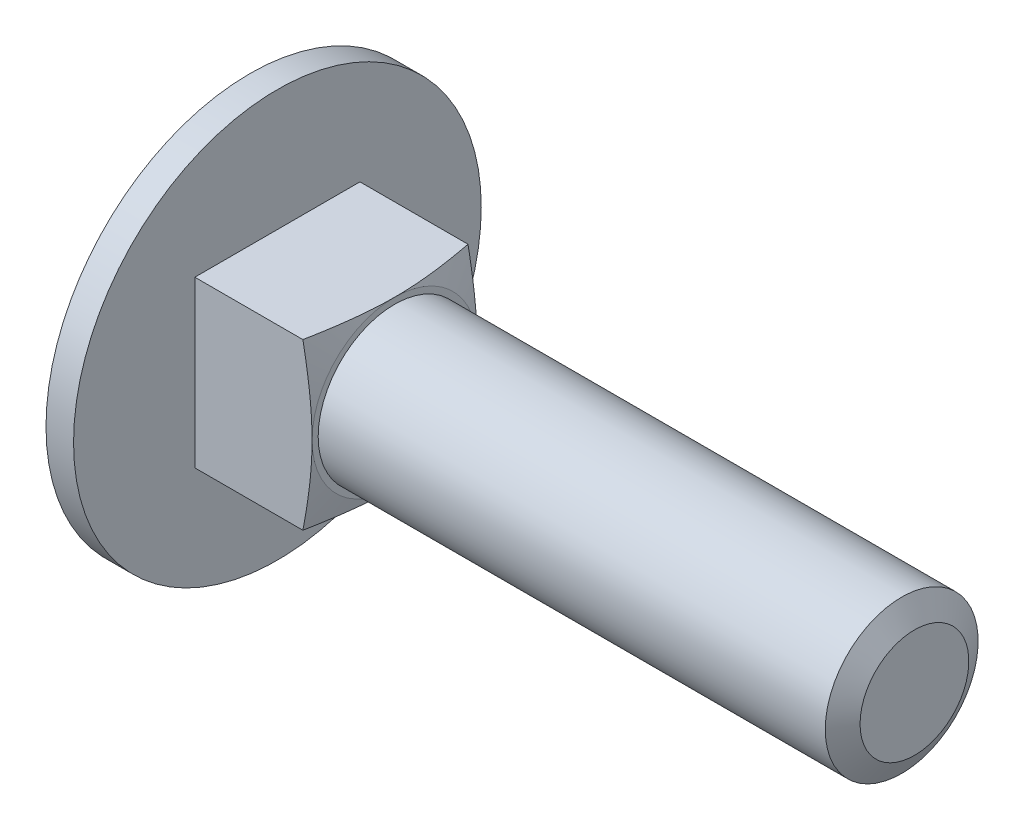
ISO-10303-21;
HEADER;
FILE_DESCRIPTION(('STEP AP214'),'2;1');
FILE_NAME('part.step','',(''),(''),'','','');
FILE_SCHEMA(('AUTOMOTIVE_DESIGN { 1 0 10303 214 1 1 1 1 }'));
ENDSEC;
DATA;
#1=APPLICATION_CONTEXT('core data for automotive mechanical design processes');
#2=APPLICATION_PROTOCOL_DEFINITION('international standard','automotive_design',2000,#1);
#3=PRODUCT_CONTEXT('',#1,'mechanical');
#4=PRODUCT('Part','Part','',(#3));
#5=PRODUCT_RELATED_PRODUCT_CATEGORY('part','',(#4));
#6=PRODUCT_DEFINITION_FORMATION('','',#4);
#7=PRODUCT_DEFINITION_CONTEXT('part definition',#1,'design');
#8=PRODUCT_DEFINITION('design','',#6,#7);
#9=PRODUCT_DEFINITION_SHAPE('','',#8);
#10=(LENGTH_UNIT() NAMED_UNIT(*) SI_UNIT(.MILLI.,.METRE.));
#11=(NAMED_UNIT(*) PLANE_ANGLE_UNIT() SI_UNIT($,.RADIAN.));
#12=(NAMED_UNIT(*) SI_UNIT($,.STERADIAN.) SOLID_ANGLE_UNIT());
#13=UNCERTAINTY_MEASURE_WITH_UNIT(LENGTH_MEASURE(1.E-05),#10,'distance_accuracy_value','');
#14=(GEOMETRIC_REPRESENTATION_CONTEXT(3) GLOBAL_UNCERTAINTY_ASSIGNED_CONTEXT((#13)) GLOBAL_UNIT_ASSIGNED_CONTEXT((#10,
#11,#12)) REPRESENTATION_CONTEXT('',''));
#15=CARTESIAN_POINT('',(0.,0.,0.));
#16=DIRECTION('',(0.,0.,1.));
#17=DIRECTION('',(1.,0.,0.));
#18=AXIS2_PLACEMENT_3D('',#15,#16,#17);
#19=CARTESIAN_POINT('',(0.,0.,0.));
#20=DIRECTION('',(-1.,0.,0.));
#21=DIRECTION('',(0.,0.,1.));
#22=AXIS2_PLACEMENT_3D('',#19,#20,#21);
#23=CYLINDRICAL_SURFACE('',#22,3.);
#24=CARTESIAN_POINT('',(4.6,0.,0.));
#25=DIRECTION('',(-1.,0.,0.));
#26=DIRECTION('',(0.,0.,1.));
#27=AXIS2_PLACEMENT_3D('',#24,#25,#26);
#28=CIRCLE('',#27,3.);
#29=CARTESIAN_POINT('',(4.6,0.,3.));
#30=VERTEX_POINT('',#29);
#31=EDGE_CURVE('E184',#30,#30,#28,.T.);
#32=ORIENTED_EDGE('',*,*,#31,.F.);
#33=EDGE_LOOP('',(#32));
#34=FACE_BOUND('',#33,.T.);
#35=CARTESIAN_POINT('',(24.5000146668818,0.,0.));
#36=DIRECTION('',(-1.,0.,0.));
#37=DIRECTION('',(0.,0.,1.));
#38=AXIS2_PLACEMENT_3D('',#35,#36,#37);
#39=CIRCLE('',#38,3.);
#40=CARTESIAN_POINT('',(24.5000146668818,0.,3.));
#41=VERTEX_POINT('',#40);
#42=EDGE_CURVE('E182',#41,#41,#39,.T.);
#43=ORIENTED_EDGE('',*,*,#42,.T.);
#44=EDGE_LOOP('',(#43));
#45=FACE_BOUND('',#44,.T.);
#46=ADVANCED_FACE('F42',(#34,#45),#23,.T.);
#47=CARTESIAN_POINT('',(4.6,-3.24,3.24));
#48=DIRECTION('',(1.,0.,0.));
#49=DIRECTION('',(0.,0.,-1.));
#50=AXIS2_PLACEMENT_3D('',#47,#48,#49);
#51=PLANE('',#50);
#52=CARTESIAN_POINT('',(4.6,0.,0.));
#53=DIRECTION('',(1.,0.,0.));
#54=DIRECTION('',(0.,0.,-1.));
#55=AXIS2_PLACEMENT_3D('',#52,#53,#54);
#56=CIRCLE('',#55,3.24);
#57=CARTESIAN_POINT('',(4.6,-3.24,0.));
#58=VERTEX_POINT('',#57);
#59=CARTESIAN_POINT('',(4.6,0.,-3.24));
#60=VERTEX_POINT('',#59);
#61=EDGE_CURVE('E46',#58,#60,#56,.T.);
#62=ORIENTED_EDGE('',*,*,#61,.T.);
#63=CARTESIAN_POINT('',(4.6,0.,0.));
#64=DIRECTION('',(1.,0.,0.));
#65=DIRECTION('',(0.,0.,-1.));
#66=AXIS2_PLACEMENT_3D('',#63,#64,#65);
#67=CIRCLE('',#66,3.24);
#68=CARTESIAN_POINT('',(4.6,3.24,0.));
#69=VERTEX_POINT('',#68);
#70=EDGE_CURVE('E58',#60,#69,#67,.T.);
#71=ORIENTED_EDGE('',*,*,#70,.T.);
#72=CARTESIAN_POINT('',(4.6,0.,3.24));
#73=VERTEX_POINT('',#72);
#74=EDGE_CURVE('E12',#69,#73,#56,.T.);
#75=ORIENTED_EDGE('',*,*,#74,.T.);
#76=EDGE_CURVE('E51',#73,#58,#56,.T.);
#77=ORIENTED_EDGE('',*,*,#76,.T.);
#78=EDGE_LOOP('',(#62,#71,#75,#77));
#79=FACE_BOUND('',#78,.T.);
#80=ORIENTED_EDGE('',*,*,#31,.T.);
#81=EDGE_LOOP('',(#80));
#82=FACE_BOUND('',#81,.T.);
#83=ADVANCED_FACE('F112',(#79,#82),#51,.T.);
#84=CARTESIAN_POINT('',(4.6,3.24,3.24));
#85=DIRECTION('',(0.,0.,-1.));
#86=DIRECTION('',(0.,1.,0.));
#87=AXIS2_PLACEMENT_3D('',#84,#85,#86);
#88=PLANE('',#87);
#89=CARTESIAN_POINT('',(3.51272290842033,-6.5391051248718,3.24));
#90=CARTESIAN_POINT('',(3.55325644828455,-6.37025363442656,3.24));
#91=CARTESIAN_POINT('',(3.59350949337711,-6.20133410505043,3.24));
#92=CARTESIAN_POINT('',(3.67330216122302,-5.86332389811059,3.24));
#93=CARTESIAN_POINT('',(3.71284177258357,-5.69423321785923,3.24));
#94=CARTESIAN_POINT('',(3.79104233265989,-5.35590079791098,3.24));
#95=CARTESIAN_POINT('',(3.82970353644131,-5.18665911728691,3.24));
#96=CARTESIAN_POINT('',(3.90594939327065,-4.84793340291623,3.24));
#97=CARTESIAN_POINT('',(3.943534049223,-4.67844936982475,3.24));
#98=CARTESIAN_POINT('',(4.01712401218816,-4.34025350431348,3.24));
#99=CARTESIAN_POINT('',(4.05313776131698,-4.17154351411169,3.24));
#100=CARTESIAN_POINT('',(4.12348484087673,-3.83377392118535,3.24));
#101=CARTESIAN_POINT('',(4.15781818775057,-3.66471432189863,3.24));
#102=CARTESIAN_POINT('',(4.22436824035208,-3.32606146344654,3.24));
#103=CARTESIAN_POINT('',(4.2565835414773,-3.15646792676365,3.24));
#104=CARTESIAN_POINT('',(4.31827425155827,-2.81677828005964,3.24));
#105=CARTESIAN_POINT('',(4.34774963962999,-2.646682166218,3.24));
#106=CARTESIAN_POINT('',(4.40354760779084,-2.30375234705419,3.24));
#107=CARTESIAN_POINT('',(4.42982545306293,-2.13091128484597,3.24));
#108=CARTESIAN_POINT('',(4.47781558001512,-1.78458776106533,3.24));
#109=CARTESIAN_POINT('',(4.49952787428122,-1.61110530126242,3.24));
#110=CARTESIAN_POINT('',(4.53726610364649,-1.26375854241936,3.24));
#111=CARTESIAN_POINT('',(4.5533000130518,-1.08989512662747,3.24));
#112=CARTESIAN_POINT('',(4.57867481209055,-0.741675535073899,3.24));
#113=CARTESIAN_POINT('',(4.58801596269693,-0.567319378791992,3.24));
#114=CARTESIAN_POINT('',(4.59929574331581,-0.217500527994458,3.24));
#115=CARTESIAN_POINT('',(4.60119766246974,-0.0420366150878778,3.24));
#116=CARTESIAN_POINT('',(4.59733161579242,0.308804457924704,3.24));
#117=CARTESIAN_POINT('',(4.59156363239594,0.484181617831109,3.24));
#118=CARTESIAN_POINT('',(4.57283367766896,0.834781492290775,3.24));
#119=CARTESIAN_POINT('',(4.55986189962343,1.01000366946467,3.24));
#120=CARTESIAN_POINT('',(4.52766468310088,1.35985705837279,3.24));
#121=CARTESIAN_POINT('',(4.50843929522191,1.53448827487695,3.24));
#122=CARTESIAN_POINT('',(4.44767143379602,2.0207677939745,3.24));
#123=CARTESIAN_POINT('',(4.40049516096884,2.33170442501846,3.24));
#124=CARTESIAN_POINT('',(4.2955004478646,2.95180002578575,3.24));
#125=CARTESIAN_POINT('',(4.2376785311992,3.2609583806961,3.24));
#126=CARTESIAN_POINT('',(4.11520578663932,3.87820911588209,3.24));
#127=CARTESIAN_POINT('',(4.05054852388665,4.18630020457055,3.24));
#128=CARTESIAN_POINT('',(3.91683614868663,4.80147237637126,3.24));
#129=CARTESIAN_POINT('',(3.84778162932323,5.10855358984055,3.24));
#130=CARTESIAN_POINT('',(3.70651015490809,5.72293375724909,3.24));
#131=CARTESIAN_POINT('',(3.63428451057403,6.03023070361889,3.24));
#132=CARTESIAN_POINT('',(3.48777027709658,6.64434000528029,3.24));
#133=CARTESIAN_POINT('',(3.41348162825657,6.95115234627692,3.24));
#134=CARTESIAN_POINT('',(3.26347258400187,7.5642432811377,3.24));
#135=CARTESIAN_POINT('',(3.1877530168983,7.87052207808857,3.24));
#136=CARTESIAN_POINT('',(3.03522679902508,8.48280910646495,3.24));
#137=CARTESIAN_POINT('',(2.95842014604834,8.7888173373398,3.24));
#138=CARTESIAN_POINT('',(2.72903751795626,9.69761854040159,3.24));
#139=CARTESIAN_POINT('',(2.57529502336965,10.3001168536813,3.24));
#140=CARTESIAN_POINT('',(2.26588245010327,11.5047312609368,3.24));
#141=CARTESIAN_POINT('',(2.11021203259914,12.1068472676014,3.24));
#142=CARTESIAN_POINT('',(1.79849015402933,13.3074342373561,3.24));
#143=CARTESIAN_POINT('',(1.64244553664376,13.9059069786891,3.24));
#144=CARTESIAN_POINT('',(1.32951161995667,15.1025135679528,3.24));
#145=CARTESIAN_POINT('',(1.17262248200706,15.7006474580628,3.24));
#146=CARTESIAN_POINT('',(1.0154747520641,16.2987127812786,3.24));
#147=B_SPLINE_CURVE_WITH_KNOTS('',3,(#89,#90,#91,#92,#93,#94,#95,#96,#97,#98,#99,#100,#101,#102,
#103,#104,#105,#106,#107,#108,#109,#110,#111,#112,#113,#114,#115,#116,#117,#118,#119,#120,#121,
#122,#123,#124,#125,#126,#127,#128,#129,#130,#131,#132,#133,#134,#135,#136,#137,#138,#139,#140,
#141,#142,#143,#144,#145,#146),.UNSPECIFIED.,.F.,.F.,(4,2,2,2,2,2,2,2,2,2,2,2,2,2,2,2,2,2,2,2,2,
2,2,2,2,2,2,2,4),(0.,0.520946218666703,1.04190074895937,1.56270202333278,2.08350189249811,
2.60102827670827,3.11854959585979,3.63641072284977,4.15427579672703,4.67870980132321,
5.20314236017698,5.72683549654152,6.25050821125709,6.77676189154188,7.3030167770292,
7.82998982951111,8.35695861835193,9.30011065607157,10.2435712328613,11.1879280377774,
12.1321577404025,13.0791595739382,14.0261888392389,14.9726857453906,15.9191845734607,
17.7845922722619,19.6503325968942,21.5057767189906,23.3608781079732),.UNSPECIFIED.);
#148=CARTESIAN_POINT('',(4.24039826591668,3.24,3.24));
#149=VERTEX_POINT('',#148);
#150=EDGE_CURVE('E94',#149,#73,#147,.F.);
#151=ORIENTED_EDGE('',*,*,#150,.F.);
#152=DIRECTION('',(-1.,0.,0.));
#153=VECTOR('',#152,1.);
#154=CARTESIAN_POINT('',(4.6,3.24,3.24));
#155=LINE('',#154,#153);
#156=CARTESIAN_POINT('',(0.,3.24,3.24));
#157=VERTEX_POINT('',#156);
#158=EDGE_CURVE('E225',#149,#157,#155,.T.);
#159=ORIENTED_EDGE('',*,*,#158,.T.);
#160=DIRECTION('',(0.,-1.,0.));
#161=VECTOR('',#160,1.);
#162=CARTESIAN_POINT('',(0.,3.24,3.24));
#163=LINE('',#162,#161);
#164=CARTESIAN_POINT('',(0.,-3.24,3.24));
#165=VERTEX_POINT('',#164);
#166=EDGE_CURVE('E102',#157,#165,#163,.T.);
#167=ORIENTED_EDGE('',*,*,#166,.T.);
#168=DIRECTION('',(-1.,0.,0.));
#169=VECTOR('',#168,1.);
#170=CARTESIAN_POINT('',(4.6,-3.24,3.24));
#171=LINE('',#170,#169);
#172=CARTESIAN_POINT('',(4.24039826591668,-3.24,3.24));
#173=VERTEX_POINT('',#172);
#174=EDGE_CURVE('E117',#173,#165,#171,.T.);
#175=ORIENTED_EDGE('',*,*,#174,.F.);
#176=EDGE_CURVE('E103',#73,#173,#147,.F.);
#177=ORIENTED_EDGE('',*,*,#176,.F.);
#178=EDGE_LOOP('',(#151,#159,#167,#175,#177));
#179=FACE_BOUND('',#178,.T.);
#180=ADVANCED_FACE('F115',(#179),#88,.F.);
#181=CARTESIAN_POINT('',(4.6,-3.24,3.24));
#182=DIRECTION('',(0.,1.,0.));
#183=DIRECTION('',(0.,0.,1.));
#184=AXIS2_PLACEMENT_3D('',#181,#182,#183);
#185=PLANE('',#184);
#186=CARTESIAN_POINT('',(3.51272290842033,-3.24,-6.5391051248718));
#187=CARTESIAN_POINT('',(3.55325644828455,-3.24,-6.37025363442656));
#188=CARTESIAN_POINT('',(3.59350949337711,-3.24,-6.20133410505043));
#189=CARTESIAN_POINT('',(3.67330216122302,-3.24,-5.86332389811059));
#190=CARTESIAN_POINT('',(3.71284177258357,-3.24,-5.69423321785923));
#191=CARTESIAN_POINT('',(3.79104233265989,-3.24,-5.35590079791098));
#192=CARTESIAN_POINT('',(3.82970353644131,-3.24,-5.18665911728691));
#193=CARTESIAN_POINT('',(3.90594939327065,-3.24,-4.84793340291623));
#194=CARTESIAN_POINT('',(3.943534049223,-3.24,-4.67844936982475));
#195=CARTESIAN_POINT('',(4.01712401218816,-3.24,-4.34025350431348));
#196=CARTESIAN_POINT('',(4.05313776131698,-3.24,-4.17154351411169));
#197=CARTESIAN_POINT('',(4.12348484087673,-3.24,-3.83377392118535));
#198=CARTESIAN_POINT('',(4.15781818775057,-3.24,-3.66471432189863));
#199=CARTESIAN_POINT('',(4.22436824035208,-3.24,-3.32606146344654));
#200=CARTESIAN_POINT('',(4.2565835414773,-3.24,-3.15646792676365));
#201=CARTESIAN_POINT('',(4.31827425155827,-3.24,-2.81677828005964));
#202=CARTESIAN_POINT('',(4.34774963962999,-3.24,-2.646682166218));
#203=CARTESIAN_POINT('',(4.40354760779084,-3.24,-2.30375234705419));
#204=CARTESIAN_POINT('',(4.42982545306293,-3.24,-2.13091128484597));
#205=CARTESIAN_POINT('',(4.47781558001512,-3.24,-1.78458776106533));
#206=CARTESIAN_POINT('',(4.49952787428122,-3.24,-1.61110530126242));
#207=CARTESIAN_POINT('',(4.53726610364649,-3.24,-1.26375854241936));
#208=CARTESIAN_POINT('',(4.5533000130518,-3.24,-1.08989512662747));
#209=CARTESIAN_POINT('',(4.57867481209055,-3.24,-0.741675535073899));
#210=CARTESIAN_POINT('',(4.58801596269693,-3.24,-0.567319378791992));
#211=CARTESIAN_POINT('',(4.59929574331581,-3.24,-0.217500527994458));
#212=CARTESIAN_POINT('',(4.60119766246974,-3.24,-0.0420366150878778));
#213=CARTESIAN_POINT('',(4.59733161579242,-3.24,0.308804457924704));
#214=CARTESIAN_POINT('',(4.59156363239594,-3.24,0.484181617831109));
#215=CARTESIAN_POINT('',(4.57283367766896,-3.24,0.834781492290775));
#216=CARTESIAN_POINT('',(4.55986189962343,-3.24,1.01000366946467));
#217=CARTESIAN_POINT('',(4.52766468310088,-3.24,1.35985705837279));
#218=CARTESIAN_POINT('',(4.50843929522191,-3.24,1.53448827487695));
#219=CARTESIAN_POINT('',(4.44767143379602,-3.24,2.0207677939745));
#220=CARTESIAN_POINT('',(4.40049516096884,-3.24,2.33170442501846));
#221=CARTESIAN_POINT('',(4.2955004478646,-3.24,2.95180002578575));
#222=CARTESIAN_POINT('',(4.2376785311992,-3.24,3.2609583806961));
#223=CARTESIAN_POINT('',(4.11520578663932,-3.24,3.87820911588209));
#224=CARTESIAN_POINT('',(4.05054852388665,-3.24,4.18630020457055));
#225=CARTESIAN_POINT('',(3.91683614868663,-3.24,4.80147237637126));
#226=CARTESIAN_POINT('',(3.84778162932323,-3.24,5.10855358984055));
#227=CARTESIAN_POINT('',(3.70651015490809,-3.24,5.72293375724909));
#228=CARTESIAN_POINT('',(3.63428451057403,-3.24,6.03023070361889));
#229=CARTESIAN_POINT('',(3.48777027709658,-3.24,6.64434000528029));
#230=CARTESIAN_POINT('',(3.41348162825657,-3.24,6.95115234627692));
#231=CARTESIAN_POINT('',(3.26347258400187,-3.24,7.5642432811377));
#232=CARTESIAN_POINT('',(3.1877530168983,-3.24,7.87052207808857));
#233=CARTESIAN_POINT('',(3.03522679902508,-3.24,8.48280910646495));
#234=CARTESIAN_POINT('',(2.95842014604834,-3.24,8.7888173373398));
#235=CARTESIAN_POINT('',(2.72903751795626,-3.24,9.69761854040159));
#236=CARTESIAN_POINT('',(2.57529502336965,-3.24,10.3001168536813));
#237=CARTESIAN_POINT('',(2.26588245010327,-3.24,11.5047312609368));
#238=CARTESIAN_POINT('',(2.11021203259914,-3.24,12.1068472676014));
#239=CARTESIAN_POINT('',(1.79849015402933,-3.24,13.3074342373561));
#240=CARTESIAN_POINT('',(1.64244553664376,-3.24,13.9059069786891));
#241=CARTESIAN_POINT('',(1.32951161995667,-3.24,15.1025135679528));
#242=CARTESIAN_POINT('',(1.17262248200707,-3.24,15.7006474580628));
#243=CARTESIAN_POINT('',(1.0154747520641,-3.24,16.2987127812786));
#244=B_SPLINE_CURVE_WITH_KNOTS('',3,(#186,#187,#188,#189,#190,#191,#192,#193,#194,#195,#196,
#197,#198,#199,#200,#201,#202,#203,#204,#205,#206,#207,#208,#209,#210,#211,#212,#213,#214,#215,
#216,#217,#218,#219,#220,#221,#222,#223,#224,#225,#226,#227,#228,#229,#230,#231,#232,#233,#234,
#235,#236,#237,#238,#239,#240,#241,#242,#243),.UNSPECIFIED.,.F.,.F.,(4,2,2,2,2,2,2,2,2,2,2,2,2,
2,2,2,2,2,2,2,2,2,2,2,2,2,2,2,4),(0.,0.520946218666703,1.04190074895937,1.56270202333278,
2.08350189249811,2.60102827670827,3.11854959585979,3.63641072284977,4.15427579672703,
4.67870980132321,5.20314236017698,5.72683549654152,6.25050821125709,6.77676189154188,
7.3030167770292,7.82998982951111,8.35695861835193,9.30011065607157,10.2435712328613,
11.1879280377774,12.1321577404025,13.0791595739382,14.0261888392389,14.9726857453906,
15.9191845734607,17.7845922722619,19.6503325968942,21.5057767189906,23.3608781079732),.UNSPECIFIED.);
#245=EDGE_CURVE('E109',#173,#58,#244,.F.);
#246=ORIENTED_EDGE('',*,*,#245,.F.);
#247=ORIENTED_EDGE('',*,*,#174,.T.);
#248=DIRECTION('',(0.,0.,-1.));
#249=VECTOR('',#248,1.);
#250=CARTESIAN_POINT('',(0.,-3.24,3.24));
#251=LINE('',#250,#249);
#252=CARTESIAN_POINT('',(0.,-3.24,-3.24));
#253=VERTEX_POINT('',#252);
#254=EDGE_CURVE('E220',#165,#253,#251,.T.);
#255=ORIENTED_EDGE('',*,*,#254,.T.);
#256=DIRECTION('',(-1.,0.,0.));
#257=VECTOR('',#256,1.);
#258=CARTESIAN_POINT('',(4.6,-3.24,-3.24));
#259=LINE('',#258,#257);
#260=CARTESIAN_POINT('',(4.24039826591669,-3.24,-3.24));
#261=VERTEX_POINT('',#260);
#262=EDGE_CURVE('E215',#261,#253,#259,.T.);
#263=ORIENTED_EDGE('',*,*,#262,.F.);
#264=EDGE_CURVE('E118',#58,#261,#244,.F.);
#265=ORIENTED_EDGE('',*,*,#264,.F.);
#266=EDGE_LOOP('',(#246,#247,#255,#263,#265));
#267=FACE_BOUND('',#266,.T.);
#268=ADVANCED_FACE('F138',(#267),#185,.F.);
#269=CARTESIAN_POINT('',(4.6,3.24,-3.24));
#270=DIRECTION('',(0.,0.,1.));
#271=DIRECTION('',(0.,-1.,0.));
#272=AXIS2_PLACEMENT_3D('',#269,#270,#271);
#273=PLANE('',#272);
#274=CARTESIAN_POINT('',(3.51272290826355,-6.53910512552478,-3.24));
#275=CARTESIAN_POINT('',(3.55325644813501,-6.37025363505272,-3.24));
#276=CARTESIAN_POINT('',(3.59350949323479,-6.20133410564978,-3.24));
#277=CARTESIAN_POINT('',(3.67330216109506,-5.86332389865628,-3.24));
#278=CARTESIAN_POINT('',(3.71284177246275,-5.69423321837809,-3.24));
#279=CARTESIAN_POINT('',(3.79104233255326,-5.35590079837618,-3.24));
#280=CARTESIAN_POINT('',(3.82970353634172,-5.18665911772529,-3.24));
#281=CARTESIAN_POINT('',(3.90594939318498,-4.84793340330093,-3.24));
#282=CARTESIAN_POINT('',(3.94353404914421,-4.6784493701826,-3.24));
#283=CARTESIAN_POINT('',(4.01712401212278,-4.34025350461817,-3.24));
#284=CARTESIAN_POINT('',(4.05313776125812,-4.17154351439008,-3.24));
#285=CARTESIAN_POINT('',(4.1234848408306,-3.83377392141108,-3.24));
#286=CARTESIAN_POINT('',(4.15781818771063,-3.664714322098,-3.24));
#287=CARTESIAN_POINT('',(4.22436824032406,-3.32606146359298,-3.24));
#288=CARTESIAN_POINT('',(4.25658354145501,-3.15646792688354,-3.24));
#289=CARTESIAN_POINT('',(4.31827425154668,-2.81677828012628,-3.24));
#290=CARTESIAN_POINT('',(4.3477496396234,-2.64668216625795,-3.24));
#291=CARTESIAN_POINT('',(4.40354760779356,-2.30375234703802,-3.24));
#292=CARTESIAN_POINT('',(4.42982545306992,-2.13091128480037,-3.24));
#293=CARTESIAN_POINT('',(4.47781558002896,-1.78458776096066,-3.24));
#294=CARTESIAN_POINT('',(4.49952787429762,-1.61110530112809,-3.24));
#295=CARTESIAN_POINT('',(4.53726610366574,-1.26375854222571,-3.24));
#296=CARTESIAN_POINT('',(4.55330001307132,-1.08989512640415,-3.24));
#297=CARTESIAN_POINT('',(4.5786748121079,-0.741675534791155,-3.24));
#298=CARTESIAN_POINT('',(4.58801596271184,-0.567319378479503,-3.24));
#299=CARTESIAN_POINT('',(4.59929574332296,-0.21750052762225,-3.24));
#300=CARTESIAN_POINT('',(4.60119766247156,-0.0420366146856974,-3.24));
#301=CARTESIAN_POINT('',(4.59733161578108,0.308804458386527,-3.24));
#302=CARTESIAN_POINT('',(4.59156363237678,0.484181618322601,-3.24));
#303=CARTESIAN_POINT('',(4.57283367763243,0.834781492841435,-3.24));
#304=CARTESIAN_POINT('',(4.55986189957734,1.01000367004483,-3.24));
#305=CARTESIAN_POINT('',(4.52766468303479,1.35985705901161,-3.24));
#306=CARTESIAN_POINT('',(4.50843929514537,1.53448827554492,-3.24));
#307=CARTESIAN_POINT('',(4.44767143369659,2.02076779467042,-3.24));
#308=CARTESIAN_POINT('',(4.4004951608595,2.33170442571324,-3.24));
#309=CARTESIAN_POINT('',(4.295500447739,2.95180002647857,-3.24));
#310=CARTESIAN_POINT('',(4.23767853106726,3.26095838138809,-3.24));
#311=CARTESIAN_POINT('',(4.11520578649698,3.87820911657256,-3.24));
#312=CARTESIAN_POINT('',(4.05054852374023,4.18630020526032,-3.24));
#313=CARTESIAN_POINT('',(3.91683614853344,4.80147237705993,-3.24));
#314=CARTESIAN_POINT('',(3.84778162916734,5.10855359052879,-3.24));
#315=CARTESIAN_POINT('',(3.70651015474783,5.72293375793576,-3.24));
#316=CARTESIAN_POINT('',(3.63428451041212,6.0302307043044,-3.24));
#317=CARTESIAN_POINT('',(3.48777027693192,6.64434000596361,-3.24));
#318=CARTESIAN_POINT('',(3.4134816280908,6.9511523469592,-3.24));
#319=CARTESIAN_POINT('',(3.26347258383422,7.56424328181809,-3.24));
#320=CARTESIAN_POINT('',(3.18775301672988,7.87052207876812,-3.24));
#321=CARTESIAN_POINT('',(3.03522679885535,8.48280910714287,-3.24));
#322=CARTESIAN_POINT('',(2.95842014587807,8.78881733801693,-3.24));
#323=CARTESIAN_POINT('',(2.72903751778577,9.69761854107198,-3.24));
#324=CARTESIAN_POINT('',(2.57529502319973,10.3001168543458,-3.24));
#325=CARTESIAN_POINT('',(2.26588244993485,11.5047312615896,-3.24));
#326=CARTESIAN_POINT('',(2.11021203243166,12.1068472682483,-3.24));
#327=CARTESIAN_POINT('',(1.79849015386322,13.307434237994,-3.24));
#328=CARTESIAN_POINT('',(1.64244553647807,13.9059069793239,-3.24));
#329=CARTESIAN_POINT('',(1.32951161979193,15.1025135685815,-3.24));
#330=CARTESIAN_POINT('',(1.17262248184285,15.7006474586885,-3.24));
#331=CARTESIAN_POINT('',(1.01547475190044,16.2987127819013,-3.24));
#332=B_SPLINE_CURVE_WITH_KNOTS('',3,(#274,#275,#276,#277,#278,#279,#280,#281,#282,#283,#284,
#285,#286,#287,#288,#289,#290,#291,#292,#293,#294,#295,#296,#297,#298,#299,#300,#301,#302,#303,
#304,#305,#306,#307,#308,#309,#310,#311,#312,#313,#314,#315,#316,#317,#318,#319,#320,#321,#322,
#323,#324,#325,#326,#327,#328,#329,#330,#331),.UNSPECIFIED.,.F.,.F.,(4,2,2,2,2,2,2,2,2,2,2,2,2,
2,2,2,2,2,2,2,2,2,2,2,2,2,2,2,4),(0.,0.52094621874998,1.04190074912592,1.56270202358248,
2.08350189283094,2.60102827712233,3.11854959635507,3.6364107234265,4.15427579738522,
4.67870980207059,5.20314236101354,5.72683549746672,6.25050821227091,6.77676189264535,
7.30301677822234,7.82998983079458,8.35695861972579,9.30011065744674,10.2435712342376,
11.1879280391542,12.1321577417798,13.0791595753133,14.0261888406118,14.9726857467616,
15.9191845748298,17.7845922736135,19.650332598228,21.5057767203151,23.3608781092886),.UNSPECIFIED.);
#333=EDGE_CURVE('E212',#261,#60,#332,.T.);
#334=ORIENTED_EDGE('',*,*,#333,.F.);
#335=ORIENTED_EDGE('',*,*,#262,.T.);
#336=DIRECTION('',(0.,1.,0.));
#337=VECTOR('',#336,1.);
#338=CARTESIAN_POINT('',(0.,3.24,-3.24));
#339=LINE('',#338,#337);
#340=CARTESIAN_POINT('',(0.,3.24,-3.24));
#341=VERTEX_POINT('',#340);
#342=EDGE_CURVE('E239',#253,#341,#339,.T.);
#343=ORIENTED_EDGE('',*,*,#342,.T.);
#344=DIRECTION('',(-1.,0.,0.));
#345=VECTOR('',#344,1.);
#346=CARTESIAN_POINT('',(4.6,3.24,-3.24));
#347=LINE('',#346,#345);
#348=CARTESIAN_POINT('',(4.24039826591669,3.24,-3.24));
#349=VERTEX_POINT('',#348);
#350=EDGE_CURVE('E221',#349,#341,#347,.T.);
#351=ORIENTED_EDGE('',*,*,#350,.F.);
#352=EDGE_CURVE('E195',#60,#349,#332,.T.);
#353=ORIENTED_EDGE('',*,*,#352,.F.);
#354=EDGE_LOOP('',(#334,#335,#343,#351,#353));
#355=FACE_BOUND('',#354,.T.);
#356=ADVANCED_FACE('F201',(#355),#273,.F.);
#357=CARTESIAN_POINT('',(4.6,3.24,3.24));
#358=DIRECTION('',(0.,-1.,0.));
#359=DIRECTION('',(0.,0.,-1.));
#360=AXIS2_PLACEMENT_3D('',#357,#358,#359);
#361=PLANE('',#360);
#362=CARTESIAN_POINT('',(3.51272290842033,3.24,-6.5391051248718));
#363=CARTESIAN_POINT('',(3.55325644828455,3.24,-6.37025363442655));
#364=CARTESIAN_POINT('',(3.59350949337711,3.24,-6.20133410505043));
#365=CARTESIAN_POINT('',(3.67330216122302,3.24,-5.86332389811059));
#366=CARTESIAN_POINT('',(3.71284177258357,3.24,-5.69423321785923));
#367=CARTESIAN_POINT('',(3.79104233265989,3.24,-5.35590079791098));
#368=CARTESIAN_POINT('',(3.82970353644131,3.24,-5.18665911728691));
#369=CARTESIAN_POINT('',(3.90594939327065,3.24,-4.84793340291622));
#370=CARTESIAN_POINT('',(3.943534049223,3.24,-4.67844936982475));
#371=CARTESIAN_POINT('',(4.01712401218816,3.24,-4.34025350431348));
#372=CARTESIAN_POINT('',(4.05313776131698,3.24,-4.17154351411169));
#373=CARTESIAN_POINT('',(4.12348484087673,3.24,-3.83377392118535));
#374=CARTESIAN_POINT('',(4.15781818775057,3.24,-3.66471432189863));
#375=CARTESIAN_POINT('',(4.22436824035208,3.24,-3.32606146344654));
#376=CARTESIAN_POINT('',(4.2565835414773,3.24,-3.15646792676365));
#377=CARTESIAN_POINT('',(4.31827425155827,3.24,-2.81677828005964));
#378=CARTESIAN_POINT('',(4.34774963962999,3.24,-2.646682166218));
#379=CARTESIAN_POINT('',(4.40354760779084,3.24,-2.30375234705419));
#380=CARTESIAN_POINT('',(4.42982545306293,3.24,-2.13091128484597));
#381=CARTESIAN_POINT('',(4.47781558001512,3.24,-1.78458776106533));
#382=CARTESIAN_POINT('',(4.49952787428122,3.24,-1.61110530126242));
#383=CARTESIAN_POINT('',(4.53726610364649,3.24,-1.26375854241936));
#384=CARTESIAN_POINT('',(4.5533000130518,3.24,-1.08989512662747));
#385=CARTESIAN_POINT('',(4.57867481209055,3.24,-0.741675535073898));
#386=CARTESIAN_POINT('',(4.58801596269693,3.24,-0.567319378791992));
#387=CARTESIAN_POINT('',(4.59929574331581,3.24,-0.217500527994457));
#388=CARTESIAN_POINT('',(4.60119766246974,3.24,-0.0420366150878768));
#389=CARTESIAN_POINT('',(4.59733161579242,3.24,0.308804457924705));
#390=CARTESIAN_POINT('',(4.59156363239594,3.24,0.48418161783111));
#391=CARTESIAN_POINT('',(4.57283367766896,3.24,0.834781492290777));
#392=CARTESIAN_POINT('',(4.55986189962343,3.24,1.01000366946467));
#393=CARTESIAN_POINT('',(4.52766468310088,3.24,1.3598570583728));
#394=CARTESIAN_POINT('',(4.50843929522191,3.24,1.53448827487695));
#395=CARTESIAN_POINT('',(4.44767143379602,3.24,2.0207677939745));
#396=CARTESIAN_POINT('',(4.40049516096884,3.24,2.33170442501846));
#397=CARTESIAN_POINT('',(4.2955004478646,3.24,2.95180002578575));
#398=CARTESIAN_POINT('',(4.2376785311992,3.24,3.2609583806961));
#399=CARTESIAN_POINT('',(4.11520578663932,3.24,3.87820911588209));
#400=CARTESIAN_POINT('',(4.05054852388665,3.24,4.18630020457055));
#401=CARTESIAN_POINT('',(3.91683614868663,3.24,4.80147237637126));
#402=CARTESIAN_POINT('',(3.84778162932323,3.24,5.10855358984055));
#403=CARTESIAN_POINT('',(3.70651015490809,3.24,5.72293375724908));
#404=CARTESIAN_POINT('',(3.63428451057403,3.24,6.03023070361889));
#405=CARTESIAN_POINT('',(3.48777027709658,3.24,6.64434000528029));
#406=CARTESIAN_POINT('',(3.41348162825657,3.24,6.95115234627691));
#407=CARTESIAN_POINT('',(3.26347258400187,3.24,7.56424328113769));
#408=CARTESIAN_POINT('',(3.18775301689831,3.24,7.87052207808857));
#409=CARTESIAN_POINT('',(3.03522679902508,3.24,8.48280910646495));
#410=CARTESIAN_POINT('',(2.95842014604834,3.24,8.78881733733979));
#411=CARTESIAN_POINT('',(2.72903751795627,3.24,9.69761854040158));
#412=CARTESIAN_POINT('',(2.57529502336965,3.24,10.3001168536813));
#413=CARTESIAN_POINT('',(2.26588245010327,3.24,11.5047312609368));
#414=CARTESIAN_POINT('',(2.11021203259914,3.24,12.1068472676014));
#415=CARTESIAN_POINT('',(1.79849015402933,3.24,13.3074342373561));
#416=CARTESIAN_POINT('',(1.64244553664376,3.24,13.9059069786891));
#417=CARTESIAN_POINT('',(1.32951161995667,3.24,15.1025135679528));
#418=CARTESIAN_POINT('',(1.17262248200706,3.24,15.7006474580628));
#419=CARTESIAN_POINT('',(1.0154747520641,3.24,16.2987127812786));
#420=B_SPLINE_CURVE_WITH_KNOTS('',3,(#362,#363,#364,#365,#366,#367,#368,#369,#370,#371,#372,
#373,#374,#375,#376,#377,#378,#379,#380,#381,#382,#383,#384,#385,#386,#387,#388,#389,#390,#391,
#392,#393,#394,#395,#396,#397,#398,#399,#400,#401,#402,#403,#404,#405,#406,#407,#408,#409,#410,
#411,#412,#413,#414,#415,#416,#417,#418,#419),.UNSPECIFIED.,.F.,.F.,(4,2,2,2,2,2,2,2,2,2,2,2,2,
2,2,2,2,2,2,2,2,2,2,2,2,2,2,2,4),(0.,0.520946218666704,1.04190074895937,1.56270202333278,
2.08350189249811,2.60102827670827,3.11854959585978,3.63641072284977,4.15427579672703,
4.67870980132321,5.20314236017698,5.72683549654152,6.25050821125709,6.77676189154188,
7.3030167770292,7.82998982951111,8.35695861835193,9.30011065607156,10.2435712328613,
11.1879280377774,12.1321577404025,13.0791595739381,14.0261888392389,14.9726857453906,
15.9191845734607,17.7845922722619,19.6503325968942,21.5057767189906,23.3608781079732),.UNSPECIFIED.);
#421=EDGE_CURVE('E194',#349,#69,#420,.T.);
#422=ORIENTED_EDGE('',*,*,#421,.F.);
#423=ORIENTED_EDGE('',*,*,#350,.T.);
#424=DIRECTION('',(0.,0.,1.));
#425=VECTOR('',#424,1.);
#426=CARTESIAN_POINT('',(0.,3.24,3.24));
#427=LINE('',#426,#425);
#428=EDGE_CURVE('E237',#341,#157,#427,.T.);
#429=ORIENTED_EDGE('',*,*,#428,.T.);
#430=ORIENTED_EDGE('',*,*,#158,.F.);
#431=EDGE_CURVE('E98',#69,#149,#420,.T.);
#432=ORIENTED_EDGE('',*,*,#431,.F.);
#433=EDGE_LOOP('',(#422,#423,#429,#430,#432));
#434=FACE_BOUND('',#433,.T.);
#435=ADVANCED_FACE('F143',(#434),#361,.F.);
#436=CARTESIAN_POINT('',(0.,8.,0.));
#437=DIRECTION('',(-1.,0.,0.));
#438=DIRECTION('',(0.,0.,1.));
#439=AXIS2_PLACEMENT_3D('',#436,#437,#438);
#440=PLANE('',#439);
#441=CARTESIAN_POINT('',(0.,0.,0.));
#442=DIRECTION('',(-1.,0.,0.));
#443=DIRECTION('',(0.,0.,1.));
#444=AXIS2_PLACEMENT_3D('',#441,#442,#443);
#445=CIRCLE('',#444,8.);
#446=CARTESIAN_POINT('',(0.,0.,8.));
#447=VERTEX_POINT('',#446);
#448=EDGE_CURVE('E223',#447,#447,#445,.T.);
#449=ORIENTED_EDGE('',*,*,#448,.F.);
#450=EDGE_LOOP('',(#449));
#451=FACE_BOUND('',#450,.T.);
#452=ORIENTED_EDGE('',*,*,#166,.F.);
#453=ORIENTED_EDGE('',*,*,#428,.F.);
#454=ORIENTED_EDGE('',*,*,#342,.F.);
#455=ORIENTED_EDGE('',*,*,#254,.F.);
#456=EDGE_LOOP('',(#452,#453,#454,#455));
#457=FACE_BOUND('',#456,.T.);
#458=ADVANCED_FACE('F141',(#451,#457),#440,.F.);
#459=CARTESIAN_POINT('',(10.3633221204037,0.,0.));
#460=DIRECTION('',(-1.,0.,0.));
#461=DIRECTION('',(0.,1.,0.));
#462=AXIS2_PLACEMENT_3D('',#459,#460,#461);
#463=SPHERICAL_SURFACE('',#462,13.9633221204037);
#464=CARTESIAN_POINT('',(-1.08108108108108,0.,0.));
#465=DIRECTION('',(-1.,0.,0.));
#466=DIRECTION('',(0.,0.,1.));
#467=AXIS2_PLACEMENT_3D('',#464,#465,#466);
#468=CIRCLE('',#467,8.);
#469=CARTESIAN_POINT('',(-1.08108108108108,0.,8.));
#470=VERTEX_POINT('',#469);
#471=EDGE_CURVE('E230',#470,#470,#468,.T.);
#472=ORIENTED_EDGE('',*,*,#471,.T.);
#473=EDGE_LOOP('',(#472));
#474=FACE_BOUND('',#473,.T.);
#475=ADVANCED_FACE('F44',(#474),#463,.T.);
#476=CARTESIAN_POINT('',(-3.6,0.,0.));
#477=DIRECTION('',(-1.,0.,0.));
#478=DIRECTION('',(0.,0.,1.));
#479=AXIS2_PLACEMENT_3D('',#476,#477,#478);
#480=CYLINDRICAL_SURFACE('',#479,8.);
#481=ORIENTED_EDGE('',*,*,#471,.F.);
#482=EDGE_LOOP('',(#481));
#483=FACE_BOUND('',#482,.T.);
#484=ORIENTED_EDGE('',*,*,#448,.T.);
#485=EDGE_LOOP('',(#484));
#486=FACE_BOUND('',#485,.T.);
#487=ADVANCED_FACE('F145',(#483,#486),#480,.T.);
#488=CARTESIAN_POINT('',(4.6,0.,0.));
#489=DIRECTION('',(-1.,0.,0.));
#490=DIRECTION('',(0.,0.,-1.));
#491=AXIS2_PLACEMENT_3D('',#488,#489,#490);
#492=CONICAL_SURFACE('',#491,3.24,1.30899693899575);
#493=ORIENTED_EDGE('',*,*,#264,.T.);
#494=ORIENTED_EDGE('',*,*,#333,.T.);
#495=ORIENTED_EDGE('',*,*,#61,.F.);
#496=EDGE_LOOP('',(#493,#494,#495));
#497=FACE_BOUND('',#496,.T.);
#498=ADVANCED_FACE('F147',(#497),#492,.T.);
#499=ORIENTED_EDGE('',*,*,#176,.T.);
#500=ORIENTED_EDGE('',*,*,#245,.T.);
#501=ORIENTED_EDGE('',*,*,#76,.F.);
#502=EDGE_LOOP('',(#499,#500,#501));
#503=FACE_BOUND('',#502,.T.);
#504=ADVANCED_FACE('F107',(#503),#492,.T.);
#505=ORIENTED_EDGE('',*,*,#150,.T.);
#506=ORIENTED_EDGE('',*,*,#74,.F.);
#507=ORIENTED_EDGE('',*,*,#431,.T.);
#508=EDGE_LOOP('',(#505,#506,#507));
#509=FACE_BOUND('',#508,.T.);
#510=ADVANCED_FACE('F96',(#509),#492,.T.);
#511=ORIENTED_EDGE('',*,*,#352,.T.);
#512=ORIENTED_EDGE('',*,*,#421,.T.);
#513=ORIENTED_EDGE('',*,*,#70,.F.);
#514=EDGE_LOOP('',(#511,#512,#513));
#515=FACE_BOUND('',#514,.T.);
#516=ADVANCED_FACE('F154',(#515),#492,.T.);
#517=CARTESIAN_POINT('',(24.5000146668818,0.,0.));
#518=DIRECTION('',(-1.,0.,0.));
#519=DIRECTION('',(0.,0.,1.));
#520=AXIS2_PLACEMENT_3D('',#517,#518,#519);
#521=CONICAL_SURFACE('',#520,3.,1.04719755119659);
#522=CARTESIAN_POINT('',(25.,0.,0.));
#523=DIRECTION('',(-1.,0.,0.));
#524=DIRECTION('',(0.,0.,1.));
#525=AXIS2_PLACEMENT_3D('',#522,#523,#524);
#526=CIRCLE('',#525,2.134);
#527=CARTESIAN_POINT('',(25.,0.,2.134));
#528=VERTEX_POINT('',#527);
#529=EDGE_CURVE('E179',#528,#528,#526,.T.);
#530=ORIENTED_EDGE('',*,*,#529,.T.);
#531=EDGE_LOOP('',(#530));
#532=FACE_BOUND('',#531,.T.);
#533=ORIENTED_EDGE('',*,*,#42,.F.);
#534=EDGE_LOOP('',(#533));
#535=FACE_BOUND('',#534,.T.);
#536=ADVANCED_FACE('F169',(#532,#535),#521,.T.);
#537=CARTESIAN_POINT('',(25.,0.,-3.));
#538=DIRECTION('',(-1.,0.,0.));
#539=DIRECTION('',(0.,0.,1.));
#540=AXIS2_PLACEMENT_3D('',#537,#538,#539);
#541=PLANE('',#540);
#542=ORIENTED_EDGE('',*,*,#529,.F.);
#543=EDGE_LOOP('',(#542));
#544=FACE_BOUND('',#543,.T.);
#545=ADVANCED_FACE('F166',(#544),#541,.F.);
#546=CLOSED_SHELL('',(#46,#83,#180,#268,#356,#435,#458,#475,#487,#498,#504,#510,#516,#536,#545));
#547=MANIFOLD_SOLID_BREP('B2',#546);
#548=ADVANCED_BREP_SHAPE_REPRESENTATION('',(#18,#547),#14);
#549=SHAPE_DEFINITION_REPRESENTATION(#9,#548);
ENDSEC;
END-ISO-10303-21;
